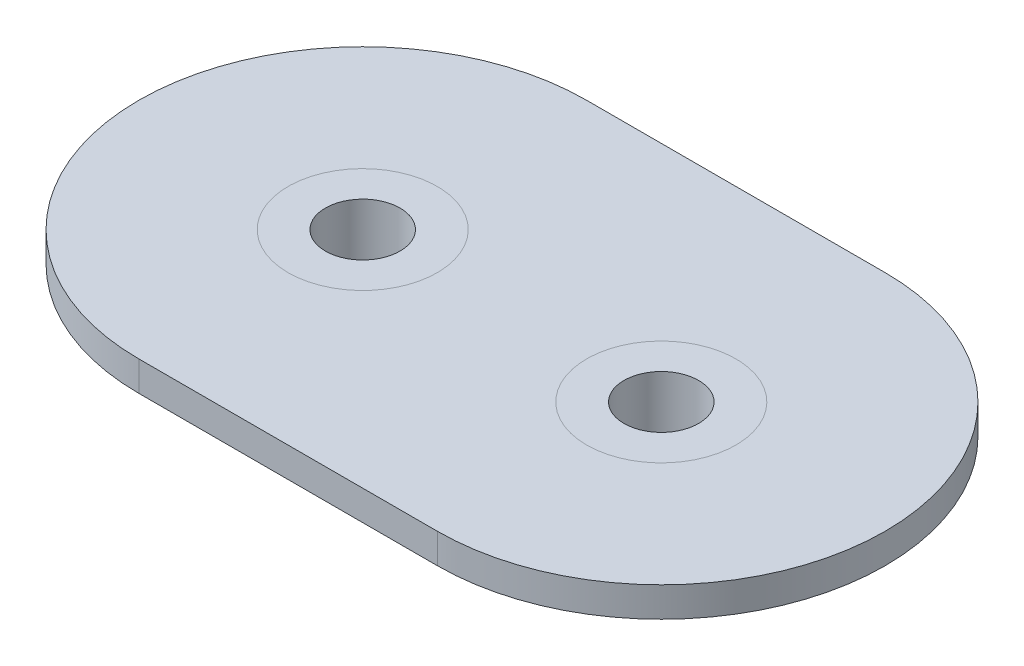
ISO-10303-21;
HEADER;
FILE_DESCRIPTION(('STEP AP214'),'2;1');
FILE_NAME('part.step','',(''),(''),'','','');
FILE_SCHEMA(('AUTOMOTIVE_DESIGN { 1 0 10303 214 1 1 1 1 }'));
ENDSEC;
DATA;
#1=APPLICATION_CONTEXT('core data for automotive mechanical design processes');
#2=APPLICATION_PROTOCOL_DEFINITION('international standard','automotive_design',2000,#1);
#3=PRODUCT_CONTEXT('',#1,'mechanical');
#4=PRODUCT('Part','Part','',(#3));
#5=PRODUCT_RELATED_PRODUCT_CATEGORY('part','',(#4));
#6=PRODUCT_DEFINITION_FORMATION('','',#4);
#7=PRODUCT_DEFINITION_CONTEXT('part definition',#1,'design');
#8=PRODUCT_DEFINITION('design','',#6,#7);
#9=PRODUCT_DEFINITION_SHAPE('','',#8);
#10=(LENGTH_UNIT() NAMED_UNIT(*) SI_UNIT(.MILLI.,.METRE.));
#11=(NAMED_UNIT(*) PLANE_ANGLE_UNIT() SI_UNIT($,.RADIAN.));
#12=(NAMED_UNIT(*) SI_UNIT($,.STERADIAN.) SOLID_ANGLE_UNIT());
#13=UNCERTAINTY_MEASURE_WITH_UNIT(LENGTH_MEASURE(1.E-05),#10,'distance_accuracy_value','');
#14=(GEOMETRIC_REPRESENTATION_CONTEXT(3) GLOBAL_UNCERTAINTY_ASSIGNED_CONTEXT((#13)) GLOBAL_UNIT_ASSIGNED_CONTEXT((#10,
#11,#12)) REPRESENTATION_CONTEXT('',''));
#15=CARTESIAN_POINT('',(0.,0.,0.));
#16=DIRECTION('',(0.,0.,1.));
#17=DIRECTION('',(1.,0.,0.));
#18=AXIS2_PLACEMENT_3D('',#15,#16,#17);
#19=CARTESIAN_POINT('',(-10.,2.,0.));
#20=DIRECTION('',(0.,-1.,0.));
#21=DIRECTION('',(0.,0.,-1.));
#22=AXIS2_PLACEMENT_3D('',#19,#20,#21);
#23=CYLINDRICAL_SURFACE('',#22,5.);
#24=CARTESIAN_POINT('',(-10.,2.,0.));
#25=DIRECTION('',(0.,1.,0.));
#26=DIRECTION('',(0.,0.,1.));
#27=AXIS2_PLACEMENT_3D('',#24,#25,#26);
#28=CIRCLE('',#27,5.);
#29=CARTESIAN_POINT('',(-10.,2.,5.));
#30=VERTEX_POINT('',#29);
#31=EDGE_CURVE('E52',#30,#30,#28,.T.);
#32=ORIENTED_EDGE('',*,*,#31,.F.);
#33=EDGE_LOOP('',(#32));
#34=FACE_BOUND('',#33,.T.);
#35=CARTESIAN_POINT('',(-10.,-6.,0.));
#36=DIRECTION('',(0.,1.,0.));
#37=DIRECTION('',(0.,0.,1.));
#38=AXIS2_PLACEMENT_3D('',#35,#36,#37);
#39=CIRCLE('',#38,5.);
#40=CARTESIAN_POINT('',(-10.,-6.,5.));
#41=VERTEX_POINT('',#40);
#42=EDGE_CURVE('E60',#41,#41,#39,.T.);
#43=ORIENTED_EDGE('',*,*,#42,.T.);
#44=EDGE_LOOP('',(#43));
#45=FACE_BOUND('',#44,.T.);
#46=ADVANCED_FACE('F46',(#34,#45),#23,.T.);
#47=CARTESIAN_POINT('',(-10.,2.,0.));
#48=DIRECTION('',(0.,-1.,0.));
#49=DIRECTION('',(0.,0.,-1.));
#50=AXIS2_PLACEMENT_3D('',#47,#48,#49);
#51=CYLINDRICAL_SURFACE('',#50,2.5);
#52=CARTESIAN_POINT('',(-10.,2.,0.));
#53=DIRECTION('',(0.,1.,0.));
#54=DIRECTION('',(0.,0.,1.));
#55=AXIS2_PLACEMENT_3D('',#52,#53,#54);
#56=CIRCLE('',#55,2.5);
#57=CARTESIAN_POINT('',(-10.,2.,2.5));
#58=VERTEX_POINT('',#57);
#59=EDGE_CURVE('E11',#58,#58,#56,.T.);
#60=ORIENTED_EDGE('',*,*,#59,.T.);
#61=EDGE_LOOP('',(#60));
#62=FACE_BOUND('',#61,.T.);
#63=CARTESIAN_POINT('',(-10.,-6.,0.));
#64=DIRECTION('',(0.,1.,0.));
#65=DIRECTION('',(0.,0.,1.));
#66=AXIS2_PLACEMENT_3D('',#63,#64,#65);
#67=CIRCLE('',#66,2.5);
#68=CARTESIAN_POINT('',(-10.,-6.,2.5));
#69=VERTEX_POINT('',#68);
#70=EDGE_CURVE('E56',#69,#69,#67,.T.);
#71=ORIENTED_EDGE('',*,*,#70,.F.);
#72=EDGE_LOOP('',(#71));
#73=FACE_BOUND('',#72,.T.);
#74=ADVANCED_FACE('F74',(#62,#73),#51,.F.);
#75=CARTESIAN_POINT('',(0.,2.,0.));
#76=DIRECTION('',(0.,1.,0.));
#77=DIRECTION('',(0.,0.,1.));
#78=AXIS2_PLACEMENT_3D('',#75,#76,#77);
#79=PLANE('',#78);
#80=ORIENTED_EDGE('',*,*,#31,.T.);
#81=EDGE_LOOP('',(#80));
#82=FACE_BOUND('',#81,.T.);
#83=ORIENTED_EDGE('',*,*,#59,.F.);
#84=EDGE_LOOP('',(#83));
#85=FACE_BOUND('',#84,.T.);
#86=ADVANCED_FACE('F70',(#82,#85),#79,.T.);
#87=CARTESIAN_POINT('',(0.,-6.,0.));
#88=DIRECTION('',(0.,1.,0.));
#89=DIRECTION('',(0.,0.,1.));
#90=AXIS2_PLACEMENT_3D('',#87,#88,#89);
#91=PLANE('',#90);
#92=ORIENTED_EDGE('',*,*,#42,.F.);
#93=EDGE_LOOP('',(#92));
#94=FACE_BOUND('',#93,.T.);
#95=ORIENTED_EDGE('',*,*,#70,.T.);
#96=EDGE_LOOP('',(#95));
#97=FACE_BOUND('',#96,.T.);
#98=ADVANCED_FACE('F67',(#94,#97),#91,.F.);
#99=CLOSED_SHELL('',(#46,#74,#86,#98));
#100=MANIFOLD_SOLID_BREP('B2',#99);
#101=CARTESIAN_POINT('',(10.,2.,0.));
#102=DIRECTION('',(0.,-1.,0.));
#103=DIRECTION('',(0.,0.,-1.));
#104=AXIS2_PLACEMENT_3D('',#101,#102,#103);
#105=CYLINDRICAL_SURFACE('',#104,2.5);
#106=CARTESIAN_POINT('',(10.,2.,0.));
#107=DIRECTION('',(0.,1.,0.));
#108=DIRECTION('',(0.,0.,1.));
#109=AXIS2_PLACEMENT_3D('',#106,#107,#108);
#110=CIRCLE('',#109,2.5);
#111=CARTESIAN_POINT('',(10.,2.,2.5));
#112=VERTEX_POINT('',#111);
#113=EDGE_CURVE('E123',#112,#112,#110,.T.);
#114=ORIENTED_EDGE('',*,*,#113,.T.);
#115=EDGE_LOOP('',(#114));
#116=FACE_BOUND('',#115,.T.);
#117=CARTESIAN_POINT('',(10.,-6.,0.));
#118=DIRECTION('',(0.,1.,0.));
#119=DIRECTION('',(0.,0.,1.));
#120=AXIS2_PLACEMENT_3D('',#117,#118,#119);
#121=CIRCLE('',#120,2.5);
#122=CARTESIAN_POINT('',(10.,-6.,2.5));
#123=VERTEX_POINT('',#122);
#124=EDGE_CURVE('E131',#123,#123,#121,.T.);
#125=ORIENTED_EDGE('',*,*,#124,.F.);
#126=EDGE_LOOP('',(#125));
#127=FACE_BOUND('',#126,.T.);
#128=ADVANCED_FACE('F117',(#116,#127),#105,.F.);
#129=CARTESIAN_POINT('',(10.,2.,0.));
#130=DIRECTION('',(0.,-1.,0.));
#131=DIRECTION('',(0.,0.,-1.));
#132=AXIS2_PLACEMENT_3D('',#129,#130,#131);
#133=CYLINDRICAL_SURFACE('',#132,5.);
#134=CARTESIAN_POINT('',(10.,2.,0.));
#135=DIRECTION('',(0.,1.,0.));
#136=DIRECTION('',(0.,0.,1.));
#137=AXIS2_PLACEMENT_3D('',#134,#135,#136);
#138=CIRCLE('',#137,5.);
#139=CARTESIAN_POINT('',(10.,2.,4.99999999999999));
#140=VERTEX_POINT('',#139);
#141=EDGE_CURVE('E45',#140,#140,#138,.T.);
#142=ORIENTED_EDGE('',*,*,#141,.F.);
#143=EDGE_LOOP('',(#142));
#144=FACE_BOUND('',#143,.T.);
#145=CARTESIAN_POINT('',(10.,-6.,0.));
#146=DIRECTION('',(0.,1.,0.));
#147=DIRECTION('',(0.,0.,1.));
#148=AXIS2_PLACEMENT_3D('',#145,#146,#147);
#149=CIRCLE('',#148,5.);
#150=CARTESIAN_POINT('',(10.,-6.,4.99999999999999));
#151=VERTEX_POINT('',#150);
#152=EDGE_CURVE('E127',#151,#151,#149,.T.);
#153=ORIENTED_EDGE('',*,*,#152,.T.);
#154=EDGE_LOOP('',(#153));
#155=FACE_BOUND('',#154,.T.);
#156=ADVANCED_FACE('F141',(#144,#155),#133,.T.);
#157=CARTESIAN_POINT('',(0.,2.,0.));
#158=DIRECTION('',(0.,1.,0.));
#159=DIRECTION('',(0.,0.,1.));
#160=AXIS2_PLACEMENT_3D('',#157,#158,#159);
#161=PLANE('',#160);
#162=ORIENTED_EDGE('',*,*,#113,.F.);
#163=EDGE_LOOP('',(#162));
#164=FACE_BOUND('',#163,.T.);
#165=ORIENTED_EDGE('',*,*,#141,.T.);
#166=EDGE_LOOP('',(#165));
#167=FACE_BOUND('',#166,.T.);
#168=ADVANCED_FACE('F145',(#164,#167),#161,.T.);
#169=CARTESIAN_POINT('',(0.,-6.,0.));
#170=DIRECTION('',(0.,1.,0.));
#171=DIRECTION('',(0.,0.,1.));
#172=AXIS2_PLACEMENT_3D('',#169,#170,#171);
#173=PLANE('',#172);
#174=ORIENTED_EDGE('',*,*,#124,.T.);
#175=EDGE_LOOP('',(#174));
#176=FACE_BOUND('',#175,.T.);
#177=ORIENTED_EDGE('',*,*,#152,.F.);
#178=EDGE_LOOP('',(#177));
#179=FACE_BOUND('',#178,.T.);
#180=ADVANCED_FACE('F137',(#176,#179),#173,.F.);
#181=CLOSED_SHELL('',(#128,#156,#168,#180));
#182=MANIFOLD_SOLID_BREP('B6',#181);
#183=CARTESIAN_POINT('',(0.,2.,15.));
#184=DIRECTION('',(0.,0.,-1.));
#185=DIRECTION('',(-1.,0.,0.));
#186=AXIS2_PLACEMENT_3D('',#183,#184,#185);
#187=PLANE('',#186);
#188=DIRECTION('',(1.,0.,0.));
#189=VECTOR('',#188,1.);
#190=CARTESIAN_POINT('',(0.,0.,15.));
#191=LINE('',#190,#189);
#192=CARTESIAN_POINT('',(-10.,0.,15.));
#193=VERTEX_POINT('',#192);
#194=CARTESIAN_POINT('',(10.,0.,15.));
#195=VERTEX_POINT('',#194);
#196=EDGE_CURVE('E255',#193,#195,#191,.T.);
#197=ORIENTED_EDGE('',*,*,#196,.T.);
#198=DIRECTION('',(0.,-1.,0.));
#199=VECTOR('',#198,1.);
#200=CARTESIAN_POINT('',(10.,2.,15.));
#201=LINE('',#200,#199);
#202=CARTESIAN_POINT('',(10.,2.,15.));
#203=VERTEX_POINT('',#202);
#204=EDGE_CURVE('E115',#203,#195,#201,.T.);
#205=ORIENTED_EDGE('',*,*,#204,.F.);
#206=DIRECTION('',(1.,0.,0.));
#207=VECTOR('',#206,1.);
#208=CARTESIAN_POINT('',(0.,2.,15.));
#209=LINE('',#208,#207);
#210=CARTESIAN_POINT('',(-10.,2.,15.));
#211=VERTEX_POINT('',#210);
#212=EDGE_CURVE('E228',#211,#203,#209,.T.);
#213=ORIENTED_EDGE('',*,*,#212,.F.);
#214=DIRECTION('',(0.,-1.,0.));
#215=VECTOR('',#214,1.);
#216=CARTESIAN_POINT('',(-10.,2.,15.));
#217=LINE('',#216,#215);
#218=EDGE_CURVE('E243',#211,#193,#217,.T.);
#219=ORIENTED_EDGE('',*,*,#218,.T.);
#220=EDGE_LOOP('',(#197,#205,#213,#219));
#221=FACE_BOUND('',#220,.T.);
#222=ADVANCED_FACE('F179',(#221),#187,.F.);
#223=CARTESIAN_POINT('',(10.,2.,0.));
#224=DIRECTION('',(0.,-1.,0.));
#225=DIRECTION('',(0.,0.,-1.));
#226=AXIS2_PLACEMENT_3D('',#223,#224,#225);
#227=CYLINDRICAL_SURFACE('',#226,15.);
#228=CARTESIAN_POINT('',(10.,0.,0.));
#229=DIRECTION('',(0.,1.,0.));
#230=DIRECTION('',(0.,0.,1.));
#231=AXIS2_PLACEMENT_3D('',#228,#229,#230);
#232=CIRCLE('',#231,15.);
#233=CARTESIAN_POINT('',(9.99999999999999,0.,-15.));
#234=VERTEX_POINT('',#233);
#235=EDGE_CURVE('E234',#195,#234,#232,.T.);
#236=ORIENTED_EDGE('',*,*,#235,.T.);
#237=DIRECTION('',(0.,-1.,0.));
#238=VECTOR('',#237,1.);
#239=CARTESIAN_POINT('',(9.99999999999999,2.,-15.));
#240=LINE('',#239,#238);
#241=CARTESIAN_POINT('',(9.99999999999999,2.,-15.));
#242=VERTEX_POINT('',#241);
#243=EDGE_CURVE('E189',#242,#234,#240,.T.);
#244=ORIENTED_EDGE('',*,*,#243,.F.);
#245=CARTESIAN_POINT('',(10.,2.,0.));
#246=DIRECTION('',(0.,1.,0.));
#247=DIRECTION('',(0.,0.,1.));
#248=AXIS2_PLACEMENT_3D('',#245,#246,#247);
#249=CIRCLE('',#248,15.);
#250=EDGE_CURVE('E223',#203,#242,#249,.T.);
#251=ORIENTED_EDGE('',*,*,#250,.F.);
#252=ORIENTED_EDGE('',*,*,#204,.T.);
#253=EDGE_LOOP('',(#236,#244,#251,#252));
#254=FACE_BOUND('',#253,.T.);
#255=ADVANCED_FACE('F233',(#254),#227,.T.);
#256=CARTESIAN_POINT('',(0.,2.,-15.));
#257=DIRECTION('',(0.,0.,-1.));
#258=DIRECTION('',(-1.,0.,0.));
#259=AXIS2_PLACEMENT_3D('',#256,#257,#258);
#260=PLANE('',#259);
#261=DIRECTION('',(1.,0.,0.));
#262=VECTOR('',#261,1.);
#263=CARTESIAN_POINT('',(0.,0.,-15.));
#264=LINE('',#263,#262);
#265=CARTESIAN_POINT('',(-10.,0.,-15.));
#266=VERTEX_POINT('',#265);
#267=EDGE_CURVE('E261',#266,#234,#264,.T.);
#268=ORIENTED_EDGE('',*,*,#267,.F.);
#269=DIRECTION('',(0.,-1.,0.));
#270=VECTOR('',#269,1.);
#271=CARTESIAN_POINT('',(-10.,2.,-15.));
#272=LINE('',#271,#270);
#273=CARTESIAN_POINT('',(-10.,2.,-15.));
#274=VERTEX_POINT('',#273);
#275=EDGE_CURVE('E213',#274,#266,#272,.T.);
#276=ORIENTED_EDGE('',*,*,#275,.F.);
#277=DIRECTION('',(1.,0.,0.));
#278=VECTOR('',#277,1.);
#279=CARTESIAN_POINT('',(0.,2.,-15.));
#280=LINE('',#279,#278);
#281=EDGE_CURVE('E226',#274,#242,#280,.T.);
#282=ORIENTED_EDGE('',*,*,#281,.T.);
#283=ORIENTED_EDGE('',*,*,#243,.T.);
#284=EDGE_LOOP('',(#268,#276,#282,#283));
#285=FACE_BOUND('',#284,.T.);
#286=ADVANCED_FACE('F239',(#285),#260,.T.);
#287=CARTESIAN_POINT('',(-10.,2.,0.));
#288=DIRECTION('',(0.,-1.,0.));
#289=DIRECTION('',(0.,0.,-1.));
#290=AXIS2_PLACEMENT_3D('',#287,#288,#289);
#291=CYLINDRICAL_SURFACE('',#290,5.);
#292=CARTESIAN_POINT('',(-10.,2.,0.));
#293=DIRECTION('',(0.,1.,0.));
#294=DIRECTION('',(0.,0.,1.));
#295=AXIS2_PLACEMENT_3D('',#292,#293,#294);
#296=CIRCLE('',#295,5.);
#297=CARTESIAN_POINT('',(-10.,2.,5.));
#298=VERTEX_POINT('',#297);
#299=EDGE_CURVE('E303',#298,#298,#296,.T.);
#300=ORIENTED_EDGE('',*,*,#299,.T.);
#301=EDGE_LOOP('',(#300));
#302=FACE_BOUND('',#301,.T.);
#303=CARTESIAN_POINT('',(-10.,0.,0.));
#304=DIRECTION('',(0.,1.,0.));
#305=DIRECTION('',(0.,0.,1.));
#306=AXIS2_PLACEMENT_3D('',#303,#304,#305);
#307=CIRCLE('',#306,5.);
#308=CARTESIAN_POINT('',(-10.,0.,5.));
#309=VERTEX_POINT('',#308);
#310=EDGE_CURVE('E251',#309,#309,#307,.T.);
#311=ORIENTED_EDGE('',*,*,#310,.F.);
#312=EDGE_LOOP('',(#311));
#313=FACE_BOUND('',#312,.T.);
#314=ADVANCED_FACE('F292',(#302,#313),#291,.F.);
#315=CARTESIAN_POINT('',(10.,2.,0.));
#316=DIRECTION('',(0.,-1.,0.));
#317=DIRECTION('',(0.,0.,-1.));
#318=AXIS2_PLACEMENT_3D('',#315,#316,#317);
#319=CYLINDRICAL_SURFACE('',#318,5.);
#320=CARTESIAN_POINT('',(10.,2.,0.));
#321=DIRECTION('',(0.,1.,0.));
#322=DIRECTION('',(0.,0.,1.));
#323=AXIS2_PLACEMENT_3D('',#320,#321,#322);
#324=CIRCLE('',#323,5.);
#325=CARTESIAN_POINT('',(10.,2.,4.99999999999999));
#326=VERTEX_POINT('',#325);
#327=EDGE_CURVE('E266',#326,#326,#324,.T.);
#328=ORIENTED_EDGE('',*,*,#327,.T.);
#329=EDGE_LOOP('',(#328));
#330=FACE_BOUND('',#329,.T.);
#331=CARTESIAN_POINT('',(10.,0.,0.));
#332=DIRECTION('',(0.,1.,0.));
#333=DIRECTION('',(0.,0.,1.));
#334=AXIS2_PLACEMENT_3D('',#331,#332,#333);
#335=CIRCLE('',#334,5.);
#336=CARTESIAN_POINT('',(10.,0.,4.99999999999999));
#337=VERTEX_POINT('',#336);
#338=EDGE_CURVE('E247',#337,#337,#335,.T.);
#339=ORIENTED_EDGE('',*,*,#338,.F.);
#340=EDGE_LOOP('',(#339));
#341=FACE_BOUND('',#340,.T.);
#342=ADVANCED_FACE('F181',(#330,#341),#319,.F.);
#343=CARTESIAN_POINT('',(-10.,2.,0.));
#344=DIRECTION('',(0.,-1.,0.));
#345=DIRECTION('',(0.,0.,-1.));
#346=AXIS2_PLACEMENT_3D('',#343,#344,#345);
#347=CYLINDRICAL_SURFACE('',#346,15.);
#348=CARTESIAN_POINT('',(-10.,0.,0.));
#349=DIRECTION('',(0.,1.,0.));
#350=DIRECTION('',(0.,0.,1.));
#351=AXIS2_PLACEMENT_3D('',#348,#349,#350);
#352=CIRCLE('',#351,15.);
#353=EDGE_CURVE('E216',#266,#193,#352,.T.);
#354=ORIENTED_EDGE('',*,*,#353,.T.);
#355=ORIENTED_EDGE('',*,*,#218,.F.);
#356=CARTESIAN_POINT('',(-10.,2.,0.));
#357=DIRECTION('',(0.,1.,0.));
#358=DIRECTION('',(0.,0.,1.));
#359=AXIS2_PLACEMENT_3D('',#356,#357,#358);
#360=CIRCLE('',#359,15.);
#361=EDGE_CURVE('E197',#274,#211,#360,.T.);
#362=ORIENTED_EDGE('',*,*,#361,.F.);
#363=ORIENTED_EDGE('',*,*,#275,.T.);
#364=EDGE_LOOP('',(#354,#355,#362,#363));
#365=FACE_BOUND('',#364,.T.);
#366=ADVANCED_FACE('F280',(#365),#347,.T.);
#367=CARTESIAN_POINT('',(0.,2.,0.));
#368=DIRECTION('',(0.,1.,0.));
#369=DIRECTION('',(0.,0.,1.));
#370=AXIS2_PLACEMENT_3D('',#367,#368,#369);
#371=PLANE('',#370);
#372=ORIENTED_EDGE('',*,*,#327,.F.);
#373=EDGE_LOOP('',(#372));
#374=FACE_BOUND('',#373,.T.);
#375=ORIENTED_EDGE('',*,*,#299,.F.);
#376=EDGE_LOOP('',(#375));
#377=FACE_BOUND('',#376,.T.);
#378=ORIENTED_EDGE('',*,*,#212,.T.);
#379=ORIENTED_EDGE('',*,*,#250,.T.);
#380=ORIENTED_EDGE('',*,*,#281,.F.);
#381=ORIENTED_EDGE('',*,*,#361,.T.);
#382=EDGE_LOOP('',(#378,#379,#380,#381));
#383=FACE_BOUND('',#382,.T.);
#384=ADVANCED_FACE('F224',(#374,#377,#383),#371,.T.);
#385=CARTESIAN_POINT('',(0.,0.,0.));
#386=DIRECTION('',(0.,1.,0.));
#387=DIRECTION('',(0.,0.,1.));
#388=AXIS2_PLACEMENT_3D('',#385,#386,#387);
#389=PLANE('',#388);
#390=ORIENTED_EDGE('',*,*,#338,.T.);
#391=EDGE_LOOP('',(#390));
#392=FACE_BOUND('',#391,.T.);
#393=ORIENTED_EDGE('',*,*,#310,.T.);
#394=EDGE_LOOP('',(#393));
#395=FACE_BOUND('',#394,.T.);
#396=ORIENTED_EDGE('',*,*,#196,.F.);
#397=ORIENTED_EDGE('',*,*,#353,.F.);
#398=ORIENTED_EDGE('',*,*,#267,.T.);
#399=ORIENTED_EDGE('',*,*,#235,.F.);
#400=EDGE_LOOP('',(#396,#397,#398,#399));
#401=FACE_BOUND('',#400,.T.);
#402=ADVANCED_FACE('F273',(#392,#395,#401),#389,.F.);
#403=CLOSED_SHELL('',(#222,#255,#286,#314,#342,#366,#384,#402));
#404=MANIFOLD_SOLID_BREP('B40',#403);
#405=ADVANCED_BREP_SHAPE_REPRESENTATION('',(#18,#100,#182,#404),#14);
#406=SHAPE_DEFINITION_REPRESENTATION(#9,#405);
ENDSEC;
END-ISO-10303-21;
